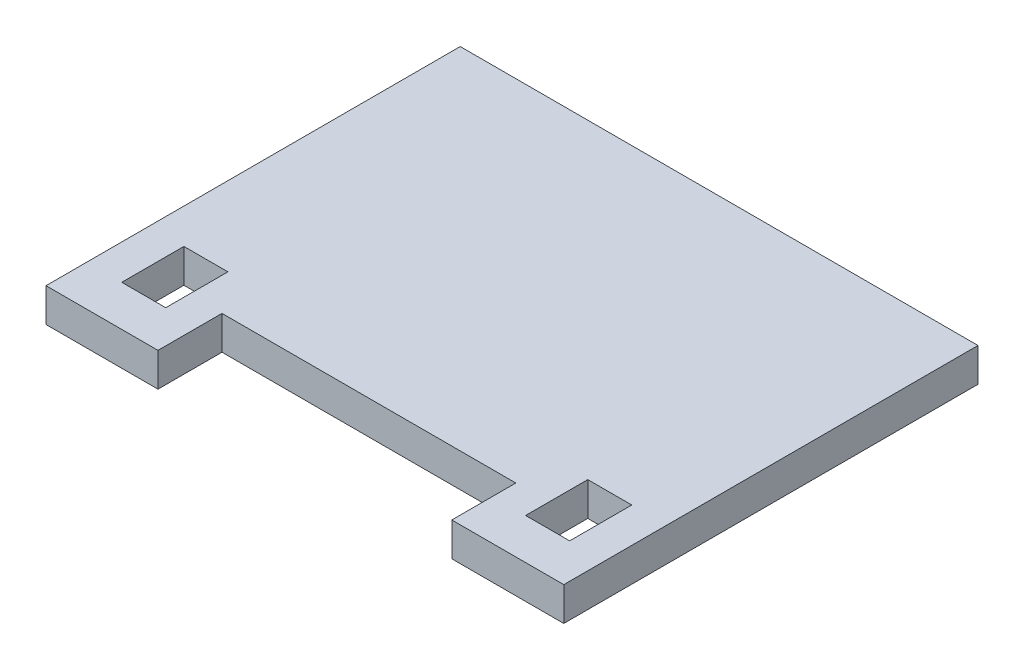
ISO-10303-21;
HEADER;
FILE_DESCRIPTION(('STEP AP214'),'2;1');
FILE_NAME('part.step','',(''),(''),'','','');
FILE_SCHEMA(('AUTOMOTIVE_DESIGN { 1 0 10303 214 1 1 1 1 }'));
ENDSEC;
DATA;
#1=APPLICATION_CONTEXT('core data for automotive mechanical design processes');
#2=APPLICATION_PROTOCOL_DEFINITION('international standard','automotive_design',2000,#1);
#3=PRODUCT_CONTEXT('',#1,'mechanical');
#4=PRODUCT('Part','Part','',(#3));
#5=PRODUCT_RELATED_PRODUCT_CATEGORY('part','',(#4));
#6=PRODUCT_DEFINITION_FORMATION('','',#4);
#7=PRODUCT_DEFINITION_CONTEXT('part definition',#1,'design');
#8=PRODUCT_DEFINITION('design','',#6,#7);
#9=PRODUCT_DEFINITION_SHAPE('','',#8);
#10=(LENGTH_UNIT() NAMED_UNIT(*) SI_UNIT(.MILLI.,.METRE.));
#11=(NAMED_UNIT(*) PLANE_ANGLE_UNIT() SI_UNIT($,.RADIAN.));
#12=(NAMED_UNIT(*) SI_UNIT($,.STERADIAN.) SOLID_ANGLE_UNIT());
#13=UNCERTAINTY_MEASURE_WITH_UNIT(LENGTH_MEASURE(1.E-05),#10,'distance_accuracy_value','');
#14=(GEOMETRIC_REPRESENTATION_CONTEXT(3) GLOBAL_UNCERTAINTY_ASSIGNED_CONTEXT((#13)) GLOBAL_UNIT_ASSIGNED_CONTEXT((#10,
#11,#12)) REPRESENTATION_CONTEXT('',''));
#15=CARTESIAN_POINT('',(0.,0.,0.));
#16=DIRECTION('',(0.,0.,1.));
#17=DIRECTION('',(1.,0.,0.));
#18=AXIS2_PLACEMENT_3D('',#15,#16,#17);
#19=CARTESIAN_POINT('',(93.2500000000003,6.5,0.));
#20=DIRECTION('',(-1.,0.,0.));
#21=DIRECTION('',(0.,0.,1.));
#22=AXIS2_PLACEMENT_3D('',#19,#20,#21);
#23=PLANE('',#22);
#24=DIRECTION('',(0.,0.,-1.));
#25=VECTOR('',#24,1.);
#26=CARTESIAN_POINT('',(93.2500000000003,0.,0.));
#27=LINE('',#26,#25);
#28=CARTESIAN_POINT('',(93.2500000000003,0.,-7.88099354789146));
#29=VERTEX_POINT('',#28);
#30=CARTESIAN_POINT('',(93.2500000000003,0.,-19.8809935478915));
#31=VERTEX_POINT('',#30);
#32=EDGE_CURVE('E240',#29,#31,#27,.T.);
#33=ORIENTED_EDGE('',*,*,#32,.F.);
#34=DIRECTION('',(0.,-1.,0.));
#35=VECTOR('',#34,1.);
#36=CARTESIAN_POINT('',(93.2500000000003,6.5,-7.88099354789146));
#37=LINE('',#36,#35);
#38=CARTESIAN_POINT('',(93.2500000000003,6.5,-7.88099354789146));
#39=VERTEX_POINT('',#38);
#40=EDGE_CURVE('E11',#39,#29,#37,.T.);
#41=ORIENTED_EDGE('',*,*,#40,.F.);
#42=DIRECTION('',(0.,0.,-1.));
#43=VECTOR('',#42,1.);
#44=CARTESIAN_POINT('',(93.2500000000003,6.5,0.));
#45=LINE('',#44,#43);
#46=CARTESIAN_POINT('',(93.2500000000003,6.5,-19.8809935478915));
#47=VERTEX_POINT('',#46);
#48=EDGE_CURVE('E186',#39,#47,#45,.T.);
#49=ORIENTED_EDGE('',*,*,#48,.T.);
#50=DIRECTION('',(0.,-1.,0.));
#51=VECTOR('',#50,1.);
#52=CARTESIAN_POINT('',(93.2500000000003,6.5,-19.8809935478915));
#53=LINE('',#52,#51);
#54=EDGE_CURVE('E122',#47,#31,#53,.T.);
#55=ORIENTED_EDGE('',*,*,#54,.T.);
#56=EDGE_LOOP('',(#33,#41,#49,#55));
#57=FACE_BOUND('',#56,.T.);
#58=ADVANCED_FACE('F43',(#57),#23,.T.);
#59=CARTESIAN_POINT('',(0.,6.5,-7.88099354789146));
#60=DIRECTION('',(0.,0.,-1.));
#61=DIRECTION('',(-1.,0.,0.));
#62=AXIS2_PLACEMENT_3D('',#59,#60,#61);
#63=PLANE('',#62);
#64=DIRECTION('',(1.,0.,0.));
#65=VECTOR('',#64,1.);
#66=CARTESIAN_POINT('',(0.,0.,-7.88099354789146));
#67=LINE('',#66,#65);
#68=CARTESIAN_POINT('',(84.7500000000003,0.,-7.88099354789146));
#69=VERTEX_POINT('',#68);
#70=EDGE_CURVE('E174',#69,#29,#67,.T.);
#71=ORIENTED_EDGE('',*,*,#70,.F.);
#72=DIRECTION('',(0.,-1.,0.));
#73=VECTOR('',#72,1.);
#74=CARTESIAN_POINT('',(84.7500000000003,6.5,-7.88099354789146));
#75=LINE('',#74,#73);
#76=CARTESIAN_POINT('',(84.7500000000003,6.5,-7.88099354789146));
#77=VERTEX_POINT('',#76);
#78=EDGE_CURVE('E54',#77,#69,#75,.T.);
#79=ORIENTED_EDGE('',*,*,#78,.F.);
#80=DIRECTION('',(1.,0.,0.));
#81=VECTOR('',#80,1.);
#82=CARTESIAN_POINT('',(0.,6.5,-7.88099354789146));
#83=LINE('',#82,#81);
#84=EDGE_CURVE('E172',#77,#39,#83,.T.);
#85=ORIENTED_EDGE('',*,*,#84,.T.);
#86=ORIENTED_EDGE('',*,*,#40,.T.);
#87=EDGE_LOOP('',(#71,#79,#85,#86));
#88=FACE_BOUND('',#87,.T.);
#89=ADVANCED_FACE('F170',(#88),#63,.T.);
#90=CARTESIAN_POINT('',(84.7500000000003,6.5,0.));
#91=DIRECTION('',(-1.,0.,0.));
#92=DIRECTION('',(0.,0.,1.));
#93=AXIS2_PLACEMENT_3D('',#90,#91,#92);
#94=PLANE('',#93);
#95=DIRECTION('',(0.,0.,-1.));
#96=VECTOR('',#95,1.);
#97=CARTESIAN_POINT('',(84.7500000000003,0.,0.));
#98=LINE('',#97,#96);
#99=CARTESIAN_POINT('',(84.7500000000003,0.,-19.8809935478915));
#100=VERTEX_POINT('',#99);
#101=EDGE_CURVE('E245',#69,#100,#98,.T.);
#102=ORIENTED_EDGE('',*,*,#101,.T.);
#103=DIRECTION('',(0.,-1.,0.));
#104=VECTOR('',#103,1.);
#105=CARTESIAN_POINT('',(84.7500000000003,6.5,-19.8809935478915));
#106=LINE('',#105,#104);
#107=CARTESIAN_POINT('',(84.7500000000003,6.5,-19.8809935478915));
#108=VERTEX_POINT('',#107);
#109=EDGE_CURVE('E178',#108,#100,#106,.T.);
#110=ORIENTED_EDGE('',*,*,#109,.F.);
#111=DIRECTION('',(0.,0.,-1.));
#112=VECTOR('',#111,1.);
#113=CARTESIAN_POINT('',(84.7500000000003,6.5,0.));
#114=LINE('',#113,#112);
#115=EDGE_CURVE('E181',#77,#108,#114,.T.);
#116=ORIENTED_EDGE('',*,*,#115,.F.);
#117=ORIENTED_EDGE('',*,*,#78,.T.);
#118=EDGE_LOOP('',(#102,#110,#116,#117));
#119=FACE_BOUND('',#118,.T.);
#120=ADVANCED_FACE('F182',(#119),#94,.F.);
#121=CARTESIAN_POINT('',(15.2500000000002,6.5,0.));
#122=DIRECTION('',(-1.,0.,0.));
#123=DIRECTION('',(0.,0.,1.));
#124=AXIS2_PLACEMENT_3D('',#121,#122,#123);
#125=PLANE('',#124);
#126=DIRECTION('',(0.,0.,-1.));
#127=VECTOR('',#126,1.);
#128=CARTESIAN_POINT('',(15.2500000000002,0.,0.));
#129=LINE('',#128,#127);
#130=CARTESIAN_POINT('',(15.2500000000002,0.,-7.88099354789168));
#131=VERTEX_POINT('',#130);
#132=CARTESIAN_POINT('',(15.2500000000002,0.,-19.8809935478917));
#133=VERTEX_POINT('',#132);
#134=EDGE_CURVE('E224',#131,#133,#129,.T.);
#135=ORIENTED_EDGE('',*,*,#134,.F.);
#136=DIRECTION('',(0.,-1.,0.));
#137=VECTOR('',#136,1.);
#138=CARTESIAN_POINT('',(15.2500000000002,6.5,-7.88099354789168));
#139=LINE('',#138,#137);
#140=CARTESIAN_POINT('',(15.2500000000002,6.5,-7.88099354789168));
#141=VERTEX_POINT('',#140);
#142=EDGE_CURVE('E253',#141,#131,#139,.T.);
#143=ORIENTED_EDGE('',*,*,#142,.F.);
#144=DIRECTION('',(0.,0.,-1.));
#145=VECTOR('',#144,1.);
#146=CARTESIAN_POINT('',(15.2500000000002,6.5,0.));
#147=LINE('',#146,#145);
#148=CARTESIAN_POINT('',(15.2500000000002,6.5,-19.8809935478917));
#149=VERTEX_POINT('',#148);
#150=EDGE_CURVE('E343',#141,#149,#147,.T.);
#151=ORIENTED_EDGE('',*,*,#150,.T.);
#152=DIRECTION('',(0.,-1.,0.));
#153=VECTOR('',#152,1.);
#154=CARTESIAN_POINT('',(15.2500000000002,6.5,-19.8809935478917));
#155=LINE('',#154,#153);
#156=EDGE_CURVE('E256',#149,#133,#155,.T.);
#157=ORIENTED_EDGE('',*,*,#156,.T.);
#158=EDGE_LOOP('',(#135,#143,#151,#157));
#159=FACE_BOUND('',#158,.T.);
#160=ADVANCED_FACE('F366',(#159),#125,.T.);
#161=CARTESIAN_POINT('',(0.,6.5,-7.88099354789168));
#162=DIRECTION('',(0.,0.,-1.));
#163=DIRECTION('',(-1.,0.,0.));
#164=AXIS2_PLACEMENT_3D('',#161,#162,#163);
#165=PLANE('',#164);
#166=DIRECTION('',(1.,0.,0.));
#167=VECTOR('',#166,1.);
#168=CARTESIAN_POINT('',(0.,0.,-7.88099354789168));
#169=LINE('',#168,#167);
#170=CARTESIAN_POINT('',(6.75000000000024,0.,-7.88099354789168));
#171=VERTEX_POINT('',#170);
#172=EDGE_CURVE('E228',#171,#131,#169,.T.);
#173=ORIENTED_EDGE('',*,*,#172,.F.);
#174=DIRECTION('',(0.,-1.,0.));
#175=VECTOR('',#174,1.);
#176=CARTESIAN_POINT('',(6.75000000000024,6.5,-7.88099354789168));
#177=LINE('',#176,#175);
#178=CARTESIAN_POINT('',(6.75000000000024,6.5,-7.88099354789168));
#179=VERTEX_POINT('',#178);
#180=EDGE_CURVE('E263',#179,#171,#177,.T.);
#181=ORIENTED_EDGE('',*,*,#180,.F.);
#182=DIRECTION('',(1.,0.,0.));
#183=VECTOR('',#182,1.);
#184=CARTESIAN_POINT('',(0.,6.5,-7.88099354789168));
#185=LINE('',#184,#183);
#186=EDGE_CURVE('E347',#179,#141,#185,.T.);
#187=ORIENTED_EDGE('',*,*,#186,.T.);
#188=ORIENTED_EDGE('',*,*,#142,.T.);
#189=EDGE_LOOP('',(#173,#181,#187,#188));
#190=FACE_BOUND('',#189,.T.);
#191=ADVANCED_FACE('F369',(#190),#165,.T.);
#192=CARTESIAN_POINT('',(6.75000000000024,6.5,0.));
#193=DIRECTION('',(-1.,0.,0.));
#194=DIRECTION('',(0.,0.,1.));
#195=AXIS2_PLACEMENT_3D('',#192,#193,#194);
#196=PLANE('',#195);
#197=DIRECTION('',(0.,0.,-1.));
#198=VECTOR('',#197,1.);
#199=CARTESIAN_POINT('',(6.75000000000024,0.,0.));
#200=LINE('',#199,#198);
#201=CARTESIAN_POINT('',(6.75000000000024,0.,-19.8809935478917));
#202=VERTEX_POINT('',#201);
#203=EDGE_CURVE('E232',#171,#202,#200,.T.);
#204=ORIENTED_EDGE('',*,*,#203,.T.);
#205=DIRECTION('',(0.,-1.,0.));
#206=VECTOR('',#205,1.);
#207=CARTESIAN_POINT('',(6.75000000000024,6.5,-19.8809935478917));
#208=LINE('',#207,#206);
#209=CARTESIAN_POINT('',(6.75000000000024,6.5,-19.8809935478917));
#210=VERTEX_POINT('',#209);
#211=EDGE_CURVE('E259',#210,#202,#208,.T.);
#212=ORIENTED_EDGE('',*,*,#211,.F.);
#213=DIRECTION('',(0.,0.,-1.));
#214=VECTOR('',#213,1.);
#215=CARTESIAN_POINT('',(6.75000000000024,6.5,0.));
#216=LINE('',#215,#214);
#217=EDGE_CURVE('E351',#179,#210,#216,.T.);
#218=ORIENTED_EDGE('',*,*,#217,.F.);
#219=ORIENTED_EDGE('',*,*,#180,.T.);
#220=EDGE_LOOP('',(#204,#212,#218,#219));
#221=FACE_BOUND('',#220,.T.);
#222=ADVANCED_FACE('F372',(#221),#196,.F.);
#223=CARTESIAN_POINT('',(78.3716624168665,6.5,0.));
#224=DIRECTION('',(-1.,0.,0.));
#225=DIRECTION('',(0.,0.,1.));
#226=AXIS2_PLACEMENT_3D('',#223,#224,#225);
#227=PLANE('',#226);
#228=DIRECTION('',(0.,0.,-1.));
#229=VECTOR('',#228,1.);
#230=CARTESIAN_POINT('',(78.3716624168665,0.,0.));
#231=LINE('',#230,#229);
#232=CARTESIAN_POINT('',(78.3716624168665,0.,0.));
#233=VERTEX_POINT('',#232);
#234=CARTESIAN_POINT('',(78.3716624168665,0.,-12.3625355156117));
#235=VERTEX_POINT('',#234);
#236=EDGE_CURVE('E197',#233,#235,#231,.T.);
#237=ORIENTED_EDGE('',*,*,#236,.F.);
#238=DIRECTION('',(0.,-1.,0.));
#239=VECTOR('',#238,1.);
#240=CARTESIAN_POINT('',(78.3716624168665,6.5,0.));
#241=LINE('',#240,#239);
#242=CARTESIAN_POINT('',(78.3716624168665,6.5,0.));
#243=VERTEX_POINT('',#242);
#244=EDGE_CURVE('E47',#243,#233,#241,.T.);
#245=ORIENTED_EDGE('',*,*,#244,.F.);
#246=DIRECTION('',(0.,0.,-1.));
#247=VECTOR('',#246,1.);
#248=CARTESIAN_POINT('',(78.3716624168665,6.5,0.));
#249=LINE('',#248,#247);
#250=CARTESIAN_POINT('',(78.3716624168665,6.5,-12.3625355156117));
#251=VERTEX_POINT('',#250);
#252=EDGE_CURVE('E250',#243,#251,#249,.T.);
#253=ORIENTED_EDGE('',*,*,#252,.T.);
#254=DIRECTION('',(0.,-1.,0.));
#255=VECTOR('',#254,1.);
#256=CARTESIAN_POINT('',(78.3716624168665,6.5,-12.3625355156117));
#257=LINE('',#256,#255);
#258=EDGE_CURVE('E196',#251,#235,#257,.T.);
#259=ORIENTED_EDGE('',*,*,#258,.T.);
#260=EDGE_LOOP('',(#237,#245,#253,#259));
#261=FACE_BOUND('',#260,.T.);
#262=ADVANCED_FACE('F45',(#261),#227,.T.);
#263=CARTESIAN_POINT('',(0.,6.5,0.));
#264=DIRECTION('',(0.,0.,-1.));
#265=DIRECTION('',(-1.,0.,0.));
#266=AXIS2_PLACEMENT_3D('',#263,#264,#265);
#267=PLANE('',#266);
#268=DIRECTION('',(1.,0.,0.));
#269=VECTOR('',#268,1.);
#270=CARTESIAN_POINT('',(0.,0.,0.));
#271=LINE('',#270,#269);
#272=CARTESIAN_POINT('',(100.,0.,0.));
#273=VERTEX_POINT('',#272);
#274=EDGE_CURVE('E201',#233,#273,#271,.T.);
#275=ORIENTED_EDGE('',*,*,#274,.T.);
#276=DIRECTION('',(0.,-1.,0.));
#277=VECTOR('',#276,1.);
#278=CARTESIAN_POINT('',(100.,6.5,0.));
#279=LINE('',#278,#277);
#280=CARTESIAN_POINT('',(100.,6.5,0.));
#281=VERTEX_POINT('',#280);
#282=EDGE_CURVE('E286',#281,#273,#279,.T.);
#283=ORIENTED_EDGE('',*,*,#282,.F.);
#284=DIRECTION('',(1.,0.,0.));
#285=VECTOR('',#284,1.);
#286=CARTESIAN_POINT('',(0.,6.5,0.));
#287=LINE('',#286,#285);
#288=EDGE_CURVE('E297',#243,#281,#287,.T.);
#289=ORIENTED_EDGE('',*,*,#288,.F.);
#290=ORIENTED_EDGE('',*,*,#244,.T.);
#291=EDGE_LOOP('',(#275,#283,#289,#290));
#292=FACE_BOUND('',#291,.T.);
#293=ADVANCED_FACE('F296',(#292),#267,.F.);
#294=CARTESIAN_POINT('',(100.,6.5,0.));
#295=DIRECTION('',(-1.,0.,0.));
#296=DIRECTION('',(0.,0.,1.));
#297=AXIS2_PLACEMENT_3D('',#294,#295,#296);
#298=PLANE('',#297);
#299=DIRECTION('',(0.,0.,-1.));
#300=VECTOR('',#299,1.);
#301=CARTESIAN_POINT('',(100.,0.,0.));
#302=LINE('',#301,#300);
#303=CARTESIAN_POINT('',(100.,0.,-80.));
#304=VERTEX_POINT('',#303);
#305=EDGE_CURVE('E204',#273,#304,#302,.T.);
#306=ORIENTED_EDGE('',*,*,#305,.T.);
#307=DIRECTION('',(0.,-1.,0.));
#308=VECTOR('',#307,1.);
#309=CARTESIAN_POINT('',(100.,6.5,-80.));
#310=LINE('',#309,#308);
#311=CARTESIAN_POINT('',(100.,6.5,-80.));
#312=VERTEX_POINT('',#311);
#313=EDGE_CURVE('E284',#312,#304,#310,.T.);
#314=ORIENTED_EDGE('',*,*,#313,.F.);
#315=DIRECTION('',(0.,0.,-1.));
#316=VECTOR('',#315,1.);
#317=CARTESIAN_POINT('',(100.,6.5,0.));
#318=LINE('',#317,#316);
#319=EDGE_CURVE('E326',#281,#312,#318,.T.);
#320=ORIENTED_EDGE('',*,*,#319,.F.);
#321=ORIENTED_EDGE('',*,*,#282,.T.);
#322=EDGE_LOOP('',(#306,#314,#320,#321));
#323=FACE_BOUND('',#322,.T.);
#324=ADVANCED_FACE('F404',(#323),#298,.F.);
#325=CARTESIAN_POINT('',(0.,6.5,-80.));
#326=DIRECTION('',(0.,0.,-1.));
#327=DIRECTION('',(-1.,0.,0.));
#328=AXIS2_PLACEMENT_3D('',#325,#326,#327);
#329=PLANE('',#328);
#330=DIRECTION('',(1.,0.,0.));
#331=VECTOR('',#330,1.);
#332=CARTESIAN_POINT('',(0.,0.,-80.));
#333=LINE('',#332,#331);
#334=CARTESIAN_POINT('',(0.,0.,-80.));
#335=VERTEX_POINT('',#334);
#336=EDGE_CURVE('E209',#335,#304,#333,.T.);
#337=ORIENTED_EDGE('',*,*,#336,.F.);
#338=DIRECTION('',(0.,-1.,0.));
#339=VECTOR('',#338,1.);
#340=CARTESIAN_POINT('',(0.,6.5,-80.));
#341=LINE('',#340,#339);
#342=CARTESIAN_POINT('',(0.,6.5,-80.));
#343=VERTEX_POINT('',#342);
#344=EDGE_CURVE('E281',#343,#335,#341,.T.);
#345=ORIENTED_EDGE('',*,*,#344,.F.);
#346=DIRECTION('',(1.,0.,0.));
#347=VECTOR('',#346,1.);
#348=CARTESIAN_POINT('',(0.,6.5,-80.));
#349=LINE('',#348,#347);
#350=EDGE_CURVE('E329',#343,#312,#349,.T.);
#351=ORIENTED_EDGE('',*,*,#350,.T.);
#352=ORIENTED_EDGE('',*,*,#313,.T.);
#353=EDGE_LOOP('',(#337,#345,#351,#352));
#354=FACE_BOUND('',#353,.T.);
#355=ADVANCED_FACE('F401',(#354),#329,.T.);
#356=CARTESIAN_POINT('',(0.,6.5,0.));
#357=DIRECTION('',(-1.,0.,0.));
#358=DIRECTION('',(0.,0.,1.));
#359=AXIS2_PLACEMENT_3D('',#356,#357,#358);
#360=PLANE('',#359);
#361=DIRECTION('',(0.,0.,-1.));
#362=VECTOR('',#361,1.);
#363=CARTESIAN_POINT('',(0.,0.,0.));
#364=LINE('',#363,#362);
#365=CARTESIAN_POINT('',(0.,0.,0.));
#366=VERTEX_POINT('',#365);
#367=EDGE_CURVE('E213',#366,#335,#364,.T.);
#368=ORIENTED_EDGE('',*,*,#367,.F.);
#369=DIRECTION('',(0.,-1.,0.));
#370=VECTOR('',#369,1.);
#371=CARTESIAN_POINT('',(0.,6.5,0.));
#372=LINE('',#371,#370);
#373=CARTESIAN_POINT('',(0.,6.5,0.));
#374=VERTEX_POINT('',#373);
#375=EDGE_CURVE('E278',#374,#366,#372,.T.);
#376=ORIENTED_EDGE('',*,*,#375,.F.);
#377=DIRECTION('',(0.,0.,-1.));
#378=VECTOR('',#377,1.);
#379=CARTESIAN_POINT('',(0.,6.5,0.));
#380=LINE('',#379,#378);
#381=EDGE_CURVE('E333',#374,#343,#380,.T.);
#382=ORIENTED_EDGE('',*,*,#381,.T.);
#383=ORIENTED_EDGE('',*,*,#344,.T.);
#384=EDGE_LOOP('',(#368,#376,#382,#383));
#385=FACE_BOUND('',#384,.T.);
#386=ADVANCED_FACE('F398',(#385),#360,.T.);
#387=CARTESIAN_POINT('',(21.628337583134,0.,0.));
#388=VERTEX_POINT('',#387);
#389=EDGE_CURVE('E205',#366,#388,#271,.T.);
#390=ORIENTED_EDGE('',*,*,#389,.T.);
#391=DIRECTION('',(0.,-1.,0.));
#392=VECTOR('',#391,1.);
#393=CARTESIAN_POINT('',(21.628337583134,6.5,0.));
#394=LINE('',#393,#392);
#395=CARTESIAN_POINT('',(21.628337583134,6.5,0.));
#396=VERTEX_POINT('',#395);
#397=EDGE_CURVE('E274',#396,#388,#394,.T.);
#398=ORIENTED_EDGE('',*,*,#397,.F.);
#399=EDGE_CURVE('E319',#374,#396,#287,.T.);
#400=ORIENTED_EDGE('',*,*,#399,.F.);
#401=ORIENTED_EDGE('',*,*,#375,.T.);
#402=EDGE_LOOP('',(#390,#398,#400,#401));
#403=FACE_BOUND('',#402,.T.);
#404=ADVANCED_FACE('F318',(#403),#267,.F.);
#405=CARTESIAN_POINT('',(21.628337583134,6.5,0.));
#406=DIRECTION('',(-1.,0.,0.));
#407=DIRECTION('',(0.,0.,1.));
#408=AXIS2_PLACEMENT_3D('',#405,#406,#407);
#409=PLANE('',#408);
#410=DIRECTION('',(0.,0.,-1.));
#411=VECTOR('',#410,1.);
#412=CARTESIAN_POINT('',(21.628337583134,0.,0.));
#413=LINE('',#412,#411);
#414=CARTESIAN_POINT('',(21.628337583134,0.,-12.3625355156117));
#415=VERTEX_POINT('',#414);
#416=EDGE_CURVE('E217',#388,#415,#413,.T.);
#417=ORIENTED_EDGE('',*,*,#416,.T.);
#418=DIRECTION('',(0.,-1.,0.));
#419=VECTOR('',#418,1.);
#420=CARTESIAN_POINT('',(21.628337583134,6.5,-12.3625355156117));
#421=LINE('',#420,#419);
#422=CARTESIAN_POINT('',(21.628337583134,6.5,-12.3625355156117));
#423=VERTEX_POINT('',#422);
#424=EDGE_CURVE('E270',#423,#415,#421,.T.);
#425=ORIENTED_EDGE('',*,*,#424,.F.);
#426=DIRECTION('',(0.,0.,-1.));
#427=VECTOR('',#426,1.);
#428=CARTESIAN_POINT('',(21.628337583134,6.5,0.));
#429=LINE('',#428,#427);
#430=EDGE_CURVE('E315',#396,#423,#429,.T.);
#431=ORIENTED_EDGE('',*,*,#430,.F.);
#432=ORIENTED_EDGE('',*,*,#397,.T.);
#433=EDGE_LOOP('',(#417,#425,#431,#432));
#434=FACE_BOUND('',#433,.T.);
#435=ADVANCED_FACE('F312',(#434),#409,.F.);
#436=CARTESIAN_POINT('',(0.,6.5,-19.8809935478917));
#437=DIRECTION('',(0.,0.,-1.));
#438=DIRECTION('',(-1.,0.,0.));
#439=AXIS2_PLACEMENT_3D('',#436,#437,#438);
#440=PLANE('',#439);
#441=DIRECTION('',(1.,0.,0.));
#442=VECTOR('',#441,1.);
#443=CARTESIAN_POINT('',(0.,0.,-19.8809935478917));
#444=LINE('',#443,#442);
#445=EDGE_CURVE('E236',#202,#133,#444,.T.);
#446=ORIENTED_EDGE('',*,*,#445,.T.);
#447=ORIENTED_EDGE('',*,*,#156,.F.);
#448=DIRECTION('',(1.,0.,0.));
#449=VECTOR('',#448,1.);
#450=CARTESIAN_POINT('',(0.,6.5,-19.8809935478917));
#451=LINE('',#450,#449);
#452=EDGE_CURVE('E190',#210,#149,#451,.T.);
#453=ORIENTED_EDGE('',*,*,#452,.F.);
#454=ORIENTED_EDGE('',*,*,#211,.T.);
#455=EDGE_LOOP('',(#446,#447,#453,#454));
#456=FACE_BOUND('',#455,.T.);
#457=ADVANCED_FACE('F363',(#456),#440,.F.);
#458=CARTESIAN_POINT('',(0.,6.5,-12.3625355156117));
#459=DIRECTION('',(0.,0.,-1.));
#460=DIRECTION('',(-1.,0.,0.));
#461=AXIS2_PLACEMENT_3D('',#458,#459,#460);
#462=PLANE('',#461);
#463=DIRECTION('',(1.,0.,0.));
#464=VECTOR('',#463,1.);
#465=CARTESIAN_POINT('',(0.,0.,-12.3625355156117));
#466=LINE('',#465,#464);
#467=EDGE_CURVE('E220',#415,#235,#466,.T.);
#468=ORIENTED_EDGE('',*,*,#467,.T.);
#469=ORIENTED_EDGE('',*,*,#258,.F.);
#470=DIRECTION('',(1.,0.,0.));
#471=VECTOR('',#470,1.);
#472=CARTESIAN_POINT('',(0.,6.5,-12.3625355156117));
#473=LINE('',#472,#471);
#474=EDGE_CURVE('E340',#423,#251,#473,.T.);
#475=ORIENTED_EDGE('',*,*,#474,.F.);
#476=ORIENTED_EDGE('',*,*,#424,.T.);
#477=EDGE_LOOP('',(#468,#469,#475,#476));
#478=FACE_BOUND('',#477,.T.);
#479=ADVANCED_FACE('F306',(#478),#462,.F.);
#480=CARTESIAN_POINT('',(0.,6.5,-19.8809935478914));
#481=DIRECTION('',(0.,0.,-1.));
#482=DIRECTION('',(-1.,0.,0.));
#483=AXIS2_PLACEMENT_3D('',#480,#481,#482);
#484=PLANE('',#483);
#485=DIRECTION('',(1.,0.,0.));
#486=VECTOR('',#485,1.);
#487=CARTESIAN_POINT('',(0.,0.,-19.8809935478914));
#488=LINE('',#487,#486);
#489=EDGE_CURVE('E115',#100,#31,#488,.T.);
#490=ORIENTED_EDGE('',*,*,#489,.T.);
#491=ORIENTED_EDGE('',*,*,#54,.F.);
#492=DIRECTION('',(1.,0.,0.));
#493=VECTOR('',#492,1.);
#494=CARTESIAN_POINT('',(0.,6.5,-19.8809935478914));
#495=LINE('',#494,#493);
#496=EDGE_CURVE('E63',#108,#47,#495,.T.);
#497=ORIENTED_EDGE('',*,*,#496,.F.);
#498=ORIENTED_EDGE('',*,*,#109,.T.);
#499=EDGE_LOOP('',(#490,#491,#497,#498));
#500=FACE_BOUND('',#499,.T.);
#501=ADVANCED_FACE('F393',(#500),#484,.F.);
#502=CARTESIAN_POINT('',(0.,6.5,0.));
#503=DIRECTION('',(0.,1.,0.));
#504=DIRECTION('',(0.,0.,1.));
#505=AXIS2_PLACEMENT_3D('',#502,#503,#504);
#506=PLANE('',#505);
#507=ORIENTED_EDGE('',*,*,#252,.F.);
#508=ORIENTED_EDGE('',*,*,#288,.T.);
#509=ORIENTED_EDGE('',*,*,#319,.T.);
#510=ORIENTED_EDGE('',*,*,#350,.F.);
#511=ORIENTED_EDGE('',*,*,#381,.F.);
#512=ORIENTED_EDGE('',*,*,#399,.T.);
#513=ORIENTED_EDGE('',*,*,#430,.T.);
#514=ORIENTED_EDGE('',*,*,#474,.T.);
#515=EDGE_LOOP('',(#507,#508,#509,#510,#511,#512,#513,#514));
#516=FACE_BOUND('',#515,.T.);
#517=ORIENTED_EDGE('',*,*,#150,.F.);
#518=ORIENTED_EDGE('',*,*,#186,.F.);
#519=ORIENTED_EDGE('',*,*,#217,.T.);
#520=ORIENTED_EDGE('',*,*,#452,.T.);
#521=EDGE_LOOP('',(#517,#518,#519,#520));
#522=FACE_BOUND('',#521,.T.);
#523=ORIENTED_EDGE('',*,*,#48,.F.);
#524=ORIENTED_EDGE('',*,*,#84,.F.);
#525=ORIENTED_EDGE('',*,*,#115,.T.);
#526=ORIENTED_EDGE('',*,*,#496,.T.);
#527=EDGE_LOOP('',(#523,#524,#525,#526));
#528=FACE_BOUND('',#527,.T.);
#529=ADVANCED_FACE('F185',(#516,#522,#528),#506,.T.);
#530=CARTESIAN_POINT('',(0.,0.,0.));
#531=DIRECTION('',(0.,1.,0.));
#532=DIRECTION('',(0.,0.,1.));
#533=AXIS2_PLACEMENT_3D('',#530,#531,#532);
#534=PLANE('',#533);
#535=ORIENTED_EDGE('',*,*,#236,.T.);
#536=ORIENTED_EDGE('',*,*,#467,.F.);
#537=ORIENTED_EDGE('',*,*,#416,.F.);
#538=ORIENTED_EDGE('',*,*,#389,.F.);
#539=ORIENTED_EDGE('',*,*,#367,.T.);
#540=ORIENTED_EDGE('',*,*,#336,.T.);
#541=ORIENTED_EDGE('',*,*,#305,.F.);
#542=ORIENTED_EDGE('',*,*,#274,.F.);
#543=EDGE_LOOP('',(#535,#536,#537,#538,#539,#540,#541,#542));
#544=FACE_BOUND('',#543,.T.);
#545=ORIENTED_EDGE('',*,*,#134,.T.);
#546=ORIENTED_EDGE('',*,*,#445,.F.);
#547=ORIENTED_EDGE('',*,*,#203,.F.);
#548=ORIENTED_EDGE('',*,*,#172,.T.);
#549=EDGE_LOOP('',(#545,#546,#547,#548));
#550=FACE_BOUND('',#549,.T.);
#551=ORIENTED_EDGE('',*,*,#32,.T.);
#552=ORIENTED_EDGE('',*,*,#489,.F.);
#553=ORIENTED_EDGE('',*,*,#101,.F.);
#554=ORIENTED_EDGE('',*,*,#70,.T.);
#555=EDGE_LOOP('',(#551,#552,#553,#554));
#556=FACE_BOUND('',#555,.T.);
#557=ADVANCED_FACE('F300',(#544,#550,#556),#534,.F.);
#558=CLOSED_SHELL('',(#58,#89,#120,#160,#191,#222,#262,#293,#324,#355,#386,#404,#435,#457,#479,
#501,#529,#557));
#559=MANIFOLD_SOLID_BREP('B2',#558);
#560=ADVANCED_BREP_SHAPE_REPRESENTATION('',(#18,#559),#14);
#561=SHAPE_DEFINITION_REPRESENTATION(#9,#560);
ENDSEC;
END-ISO-10303-21;
